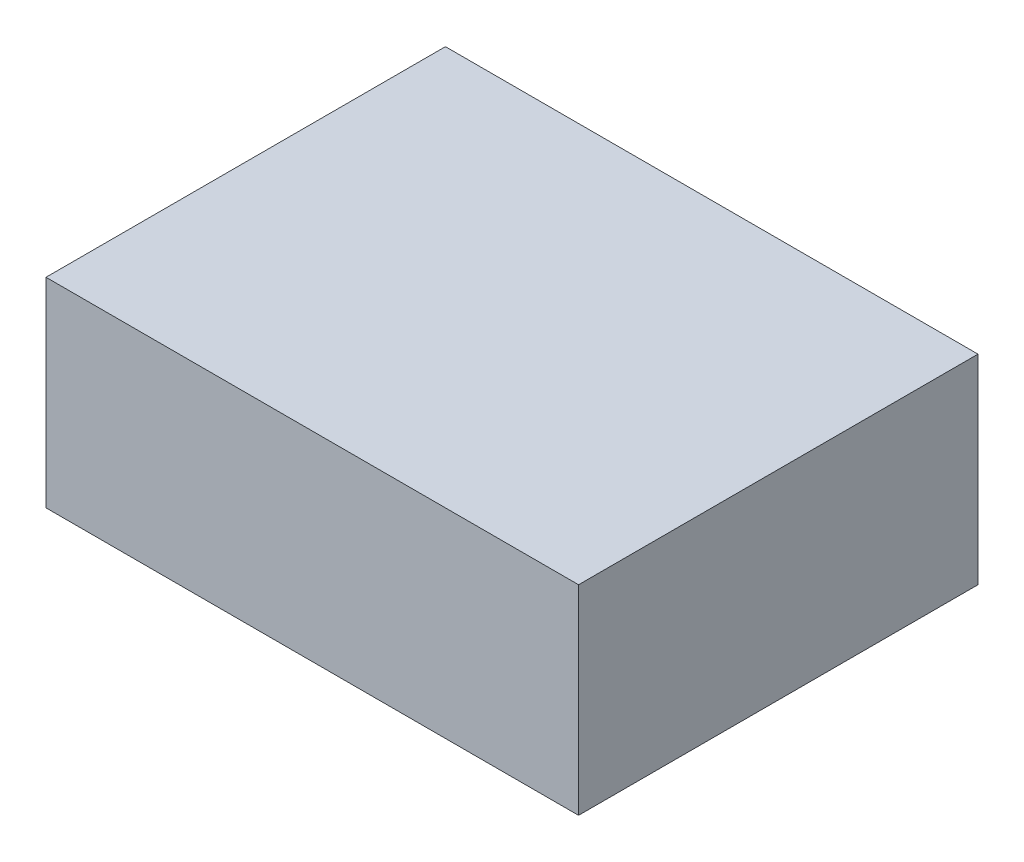
ISO-10303-21;
HEADER;
FILE_DESCRIPTION(('STEP AP214'),'2;1');
FILE_NAME('part.step','',(''),(''),'','','');
FILE_SCHEMA(('AUTOMOTIVE_DESIGN { 1 0 10303 214 1 1 1 1 }'));
ENDSEC;
DATA;
#1=APPLICATION_CONTEXT('core data for automotive mechanical design processes');
#2=APPLICATION_PROTOCOL_DEFINITION('international standard','automotive_design',2000,#1);
#3=PRODUCT_CONTEXT('',#1,'mechanical');
#4=PRODUCT('Part','Part','',(#3));
#5=PRODUCT_RELATED_PRODUCT_CATEGORY('part','',(#4));
#6=PRODUCT_DEFINITION_FORMATION('','',#4);
#7=PRODUCT_DEFINITION_CONTEXT('part definition',#1,'design');
#8=PRODUCT_DEFINITION('design','',#6,#7);
#9=PRODUCT_DEFINITION_SHAPE('','',#8);
#10=(LENGTH_UNIT() NAMED_UNIT(*) SI_UNIT(.MILLI.,.METRE.));
#11=(NAMED_UNIT(*) PLANE_ANGLE_UNIT() SI_UNIT($,.RADIAN.));
#12=(NAMED_UNIT(*) SI_UNIT($,.STERADIAN.) SOLID_ANGLE_UNIT());
#13=UNCERTAINTY_MEASURE_WITH_UNIT(LENGTH_MEASURE(1.E-05),#10,'distance_accuracy_value','');
#14=(GEOMETRIC_REPRESENTATION_CONTEXT(3) GLOBAL_UNCERTAINTY_ASSIGNED_CONTEXT((#13)) GLOBAL_UNIT_ASSIGNED_CONTEXT((#10,
#11,#12)) REPRESENTATION_CONTEXT('',''));
#15=CARTESIAN_POINT('',(0.,0.,0.));
#16=DIRECTION('',(0.,0.,1.));
#17=DIRECTION('',(1.,0.,0.));
#18=AXIS2_PLACEMENT_3D('',#15,#16,#17);
#19=CARTESIAN_POINT('',(-50.8,38.1,-38.1));
#20=DIRECTION('',(0.,0.,-1.));
#21=DIRECTION('',(-1.,0.,0.));
#22=AXIS2_PLACEMENT_3D('',#19,#20,#21);
#23=PLANE('',#22);
#24=DIRECTION('',(1.,0.,0.));
#25=VECTOR('',#24,1.);
#26=CARTESIAN_POINT('',(-50.8,0.,-38.1));
#27=LINE('',#26,#25);
#28=CARTESIAN_POINT('',(-50.8,0.,-38.1));
#29=VERTEX_POINT('',#28);
#30=CARTESIAN_POINT('',(50.8,0.,-38.1));
#31=VERTEX_POINT('',#30);
#32=EDGE_CURVE('E98',#29,#31,#27,.T.);
#33=ORIENTED_EDGE('',*,*,#32,.F.);
#34=DIRECTION('',(0.,-1.,0.));
#35=VECTOR('',#34,1.);
#36=CARTESIAN_POINT('',(-50.8,38.1,-38.1));
#37=LINE('',#36,#35);
#38=CARTESIAN_POINT('',(-50.8,38.1,-38.1));
#39=VERTEX_POINT('',#38);
#40=EDGE_CURVE('E11',#39,#29,#37,.T.);
#41=ORIENTED_EDGE('',*,*,#40,.F.);
#42=DIRECTION('',(1.,0.,0.));
#43=VECTOR('',#42,1.);
#44=CARTESIAN_POINT('',(-50.8,38.1,-38.1));
#45=LINE('',#44,#43);
#46=CARTESIAN_POINT('',(50.8,38.1,-38.1));
#47=VERTEX_POINT('',#46);
#48=EDGE_CURVE('E93',#39,#47,#45,.T.);
#49=ORIENTED_EDGE('',*,*,#48,.T.);
#50=DIRECTION('',(0.,-1.,0.));
#51=VECTOR('',#50,1.);
#52=CARTESIAN_POINT('',(50.8,38.1,-38.1));
#53=LINE('',#52,#51);
#54=EDGE_CURVE('E36',#47,#31,#53,.T.);
#55=ORIENTED_EDGE('',*,*,#54,.T.);
#56=EDGE_LOOP('',(#33,#41,#49,#55));
#57=FACE_BOUND('',#56,.T.);
#58=ADVANCED_FACE('F33',(#57),#23,.T.);
#59=CARTESIAN_POINT('',(-50.8,38.1,-38.1));
#60=DIRECTION('',(1.,0.,0.));
#61=DIRECTION('',(0.,0.,-1.));
#62=AXIS2_PLACEMENT_3D('',#59,#60,#61);
#63=PLANE('',#62);
#64=DIRECTION('',(0.,0.,1.));
#65=VECTOR('',#64,1.);
#66=CARTESIAN_POINT('',(-50.8,0.,-38.1));
#67=LINE('',#66,#65);
#68=CARTESIAN_POINT('',(-50.8,0.,38.1));
#69=VERTEX_POINT('',#68);
#70=EDGE_CURVE('E66',#29,#69,#67,.T.);
#71=ORIENTED_EDGE('',*,*,#70,.T.);
#72=DIRECTION('',(0.,-1.,0.));
#73=VECTOR('',#72,1.);
#74=CARTESIAN_POINT('',(-50.8,38.1,38.1));
#75=LINE('',#74,#73);
#76=CARTESIAN_POINT('',(-50.8,38.1,38.1));
#77=VERTEX_POINT('',#76);
#78=EDGE_CURVE('E42',#77,#69,#75,.T.);
#79=ORIENTED_EDGE('',*,*,#78,.F.);
#80=DIRECTION('',(0.,0.,1.));
#81=VECTOR('',#80,1.);
#82=CARTESIAN_POINT('',(-50.8,38.1,-38.1));
#83=LINE('',#82,#81);
#84=EDGE_CURVE('E83',#39,#77,#83,.T.);
#85=ORIENTED_EDGE('',*,*,#84,.F.);
#86=ORIENTED_EDGE('',*,*,#40,.T.);
#87=EDGE_LOOP('',(#71,#79,#85,#86));
#88=FACE_BOUND('',#87,.T.);
#89=ADVANCED_FACE('F108',(#88),#63,.F.);
#90=CARTESIAN_POINT('',(-50.8,38.1,38.1));
#91=DIRECTION('',(0.,0.,-1.));
#92=DIRECTION('',(-1.,0.,0.));
#93=AXIS2_PLACEMENT_3D('',#90,#91,#92);
#94=PLANE('',#93);
#95=DIRECTION('',(1.,0.,0.));
#96=VECTOR('',#95,1.);
#97=CARTESIAN_POINT('',(-50.8,0.,38.1));
#98=LINE('',#97,#96);
#99=CARTESIAN_POINT('',(50.8,0.,38.1));
#100=VERTEX_POINT('',#99);
#101=EDGE_CURVE('E90',#69,#100,#98,.T.);
#102=ORIENTED_EDGE('',*,*,#101,.T.);
#103=DIRECTION('',(0.,-1.,0.));
#104=VECTOR('',#103,1.);
#105=CARTESIAN_POINT('',(50.8,38.1,38.1));
#106=LINE('',#105,#104);
#107=CARTESIAN_POINT('',(50.8,38.1,38.1));
#108=VERTEX_POINT('',#107);
#109=EDGE_CURVE('E87',#108,#100,#106,.T.);
#110=ORIENTED_EDGE('',*,*,#109,.F.);
#111=DIRECTION('',(1.,0.,0.));
#112=VECTOR('',#111,1.);
#113=CARTESIAN_POINT('',(-50.8,38.1,38.1));
#114=LINE('',#113,#112);
#115=EDGE_CURVE('E78',#77,#108,#114,.T.);
#116=ORIENTED_EDGE('',*,*,#115,.F.);
#117=ORIENTED_EDGE('',*,*,#78,.T.);
#118=EDGE_LOOP('',(#102,#110,#116,#117));
#119=FACE_BOUND('',#118,.T.);
#120=ADVANCED_FACE('F88',(#119),#94,.F.);
#121=CARTESIAN_POINT('',(50.8,38.1,-38.1));
#122=DIRECTION('',(1.,0.,0.));
#123=DIRECTION('',(0.,0.,-1.));
#124=AXIS2_PLACEMENT_3D('',#121,#122,#123);
#125=PLANE('',#124);
#126=DIRECTION('',(0.,0.,1.));
#127=VECTOR('',#126,1.);
#128=CARTESIAN_POINT('',(50.8,0.,-38.1));
#129=LINE('',#128,#127);
#130=EDGE_CURVE('E101',#31,#100,#129,.T.);
#131=ORIENTED_EDGE('',*,*,#130,.F.);
#132=ORIENTED_EDGE('',*,*,#54,.F.);
#133=DIRECTION('',(0.,0.,1.));
#134=VECTOR('',#133,1.);
#135=CARTESIAN_POINT('',(50.8,38.1,-38.1));
#136=LINE('',#135,#134);
#137=EDGE_CURVE('E82',#47,#108,#136,.T.);
#138=ORIENTED_EDGE('',*,*,#137,.T.);
#139=ORIENTED_EDGE('',*,*,#109,.T.);
#140=EDGE_LOOP('',(#131,#132,#138,#139));
#141=FACE_BOUND('',#140,.T.);
#142=ADVANCED_FACE('F92',(#141),#125,.T.);
#143=CARTESIAN_POINT('',(0.,38.1,0.));
#144=DIRECTION('',(0.,-1.,0.));
#145=DIRECTION('',(0.,0.,-1.));
#146=AXIS2_PLACEMENT_3D('',#143,#144,#145);
#147=PLANE('',#146);
#148=ORIENTED_EDGE('',*,*,#48,.F.);
#149=ORIENTED_EDGE('',*,*,#84,.T.);
#150=ORIENTED_EDGE('',*,*,#115,.T.);
#151=ORIENTED_EDGE('',*,*,#137,.F.);
#152=EDGE_LOOP('',(#148,#149,#150,#151));
#153=FACE_BOUND('',#152,.T.);
#154=ADVANCED_FACE('F81',(#153),#147,.F.);
#155=CARTESIAN_POINT('',(0.,0.,0.));
#156=DIRECTION('',(0.,-1.,0.));
#157=DIRECTION('',(0.,0.,-1.));
#158=AXIS2_PLACEMENT_3D('',#155,#156,#157);
#159=PLANE('',#158);
#160=ORIENTED_EDGE('',*,*,#32,.T.);
#161=ORIENTED_EDGE('',*,*,#130,.T.);
#162=ORIENTED_EDGE('',*,*,#101,.F.);
#163=ORIENTED_EDGE('',*,*,#70,.F.);
#164=EDGE_LOOP('',(#160,#161,#162,#163));
#165=FACE_BOUND('',#164,.T.);
#166=ADVANCED_FACE('F106',(#165),#159,.T.);
#167=CLOSED_SHELL('',(#58,#89,#120,#142,#154,#166));
#168=MANIFOLD_SOLID_BREP('B2',#167);
#169=ADVANCED_BREP_SHAPE_REPRESENTATION('',(#18,#168),#14);
#170=SHAPE_DEFINITION_REPRESENTATION(#9,#169);
ENDSEC;
END-ISO-10303-21;
